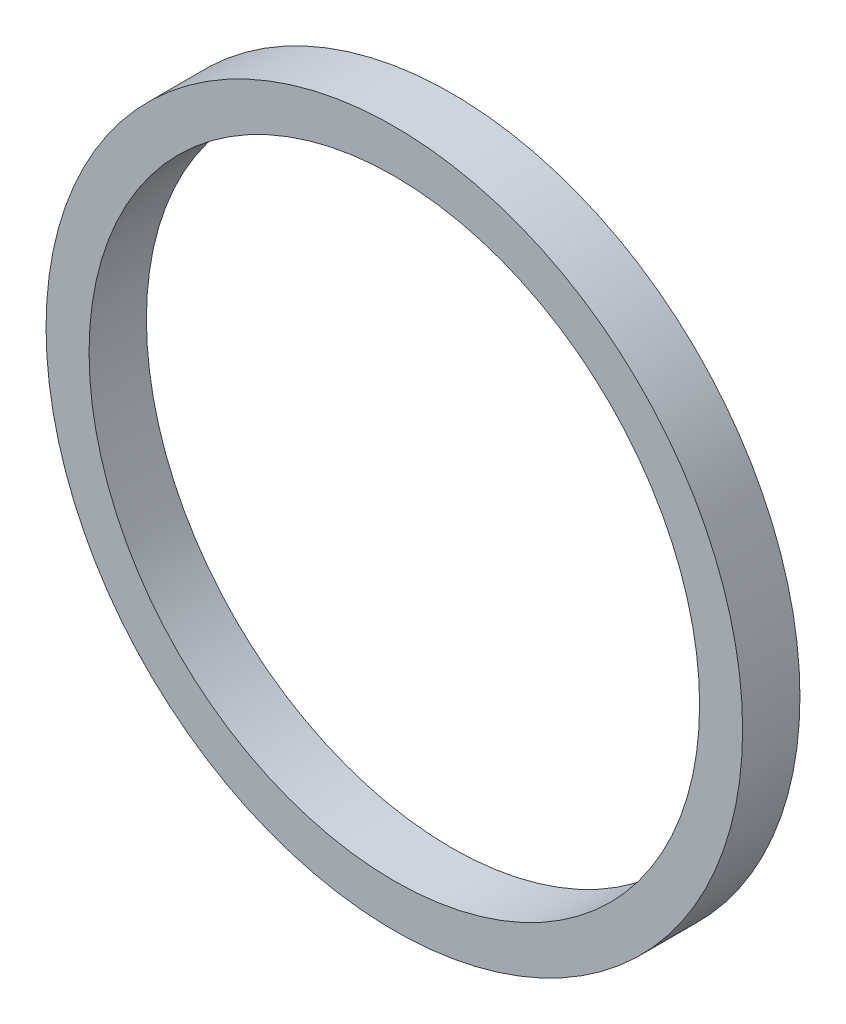
ISO-10303-21;
HEADER;
FILE_DESCRIPTION(('STEP AP214'),'2;1');
FILE_NAME('part.step','',(''),(''),'','','');
FILE_SCHEMA(('AUTOMOTIVE_DESIGN { 1 0 10303 214 1 1 1 1 }'));
ENDSEC;
DATA;
#1=APPLICATION_CONTEXT('core data for automotive mechanical design processes');
#2=APPLICATION_PROTOCOL_DEFINITION('international standard','automotive_design',2000,#1);
#3=PRODUCT_CONTEXT('',#1,'mechanical');
#4=PRODUCT('Part','Part','',(#3));
#5=PRODUCT_RELATED_PRODUCT_CATEGORY('part','',(#4));
#6=PRODUCT_DEFINITION_FORMATION('','',#4);
#7=PRODUCT_DEFINITION_CONTEXT('part definition',#1,'design');
#8=PRODUCT_DEFINITION('design','',#6,#7);
#9=PRODUCT_DEFINITION_SHAPE('','',#8);
#10=(LENGTH_UNIT() NAMED_UNIT(*) SI_UNIT(.MILLI.,.METRE.));
#11=(NAMED_UNIT(*) PLANE_ANGLE_UNIT() SI_UNIT($,.RADIAN.));
#12=(NAMED_UNIT(*) SI_UNIT($,.STERADIAN.) SOLID_ANGLE_UNIT());
#13=UNCERTAINTY_MEASURE_WITH_UNIT(LENGTH_MEASURE(1.E-05),#10,'distance_accuracy_value','');
#14=(GEOMETRIC_REPRESENTATION_CONTEXT(3) GLOBAL_UNCERTAINTY_ASSIGNED_CONTEXT((#13)) GLOBAL_UNIT_ASSIGNED_CONTEXT((#10,
#11,#12)) REPRESENTATION_CONTEXT('',''));
#15=CARTESIAN_POINT('',(0.,0.,0.));
#16=DIRECTION('',(0.,0.,1.));
#17=DIRECTION('',(1.,0.,0.));
#18=AXIS2_PLACEMENT_3D('',#15,#16,#17);
#19=CARTESIAN_POINT('',(0.,0.,2.));
#20=DIRECTION('',(0.,0.,1.));
#21=DIRECTION('',(1.,0.,0.));
#22=AXIS2_PLACEMENT_3D('',#19,#20,#21);
#23=PLANE('',#22);
#24=CARTESIAN_POINT('',(0.,0.,2.));
#25=DIRECTION('',(0.,0.,1.));
#26=DIRECTION('',(1.,0.,0.));
#27=AXIS2_PLACEMENT_3D('',#24,#25,#26);
#28=CIRCLE('',#27,12.15);
#29=CARTESIAN_POINT('',(12.15,0.,2.));
#30=VERTEX_POINT('',#29);
#31=EDGE_CURVE('E10',#30,#30,#28,.T.);
#32=ORIENTED_EDGE('',*,*,#31,.T.);
#33=EDGE_LOOP('',(#32));
#34=FACE_BOUND('',#33,.T.);
#35=CARTESIAN_POINT('',(0.,0.,2.));
#36=DIRECTION('',(0.,0.,1.));
#37=DIRECTION('',(1.,0.,0.));
#38=AXIS2_PLACEMENT_3D('',#35,#36,#37);
#39=CIRCLE('',#38,10.65);
#40=CARTESIAN_POINT('',(10.65,0.,2.));
#41=VERTEX_POINT('',#40);
#42=EDGE_CURVE('E44',#41,#41,#39,.T.);
#43=ORIENTED_EDGE('',*,*,#42,.F.);
#44=EDGE_LOOP('',(#43));
#45=FACE_BOUND('',#44,.T.);
#46=ADVANCED_FACE('F33',(#34,#45),#23,.T.);
#47=CARTESIAN_POINT('',(0.,0.,0.));
#48=DIRECTION('',(0.,0.,1.));
#49=DIRECTION('',(1.,0.,0.));
#50=AXIS2_PLACEMENT_3D('',#47,#48,#49);
#51=PLANE('',#50);
#52=CARTESIAN_POINT('',(0.,0.,0.));
#53=DIRECTION('',(0.,0.,1.));
#54=DIRECTION('',(1.,0.,0.));
#55=AXIS2_PLACEMENT_3D('',#52,#53,#54);
#56=CIRCLE('',#55,12.15);
#57=CARTESIAN_POINT('',(12.15,0.,0.));
#58=VERTEX_POINT('',#57);
#59=EDGE_CURVE('E37',#58,#58,#56,.T.);
#60=ORIENTED_EDGE('',*,*,#59,.F.);
#61=EDGE_LOOP('',(#60));
#62=FACE_BOUND('',#61,.T.);
#63=CARTESIAN_POINT('',(0.,0.,0.));
#64=DIRECTION('',(0.,0.,1.));
#65=DIRECTION('',(1.,0.,0.));
#66=AXIS2_PLACEMENT_3D('',#63,#64,#65);
#67=CIRCLE('',#66,10.65);
#68=CARTESIAN_POINT('',(10.65,0.,0.));
#69=VERTEX_POINT('',#68);
#70=EDGE_CURVE('E46',#69,#69,#67,.T.);
#71=ORIENTED_EDGE('',*,*,#70,.T.);
#72=EDGE_LOOP('',(#71));
#73=FACE_BOUND('',#72,.T.);
#74=ADVANCED_FACE('F56',(#62,#73),#51,.F.);
#75=CARTESIAN_POINT('',(0.,0.,2.));
#76=DIRECTION('',(0.,0.,-1.));
#77=DIRECTION('',(-1.,0.,0.));
#78=AXIS2_PLACEMENT_3D('',#75,#76,#77);
#79=CYLINDRICAL_SURFACE('',#78,12.15);
#80=ORIENTED_EDGE('',*,*,#31,.F.);
#81=EDGE_LOOP('',(#80));
#82=FACE_BOUND('',#81,.T.);
#83=ORIENTED_EDGE('',*,*,#59,.T.);
#84=EDGE_LOOP('',(#83));
#85=FACE_BOUND('',#84,.T.);
#86=ADVANCED_FACE('F35',(#82,#85),#79,.T.);
#87=CARTESIAN_POINT('',(0.,0.,2.));
#88=DIRECTION('',(0.,0.,-1.));
#89=DIRECTION('',(-1.,0.,0.));
#90=AXIS2_PLACEMENT_3D('',#87,#88,#89);
#91=CYLINDRICAL_SURFACE('',#90,10.65);
#92=ORIENTED_EDGE('',*,*,#42,.T.);
#93=EDGE_LOOP('',(#92));
#94=FACE_BOUND('',#93,.T.);
#95=ORIENTED_EDGE('',*,*,#70,.F.);
#96=EDGE_LOOP('',(#95));
#97=FACE_BOUND('',#96,.T.);
#98=ADVANCED_FACE('F52',(#94,#97),#91,.F.);
#99=CLOSED_SHELL('',(#46,#74,#86,#98));
#100=MANIFOLD_SOLID_BREP('B2',#99);
#101=ADVANCED_BREP_SHAPE_REPRESENTATION('',(#18,#100),#14);
#102=SHAPE_DEFINITION_REPRESENTATION(#9,#101);
ENDSEC;
END-ISO-10303-21;
